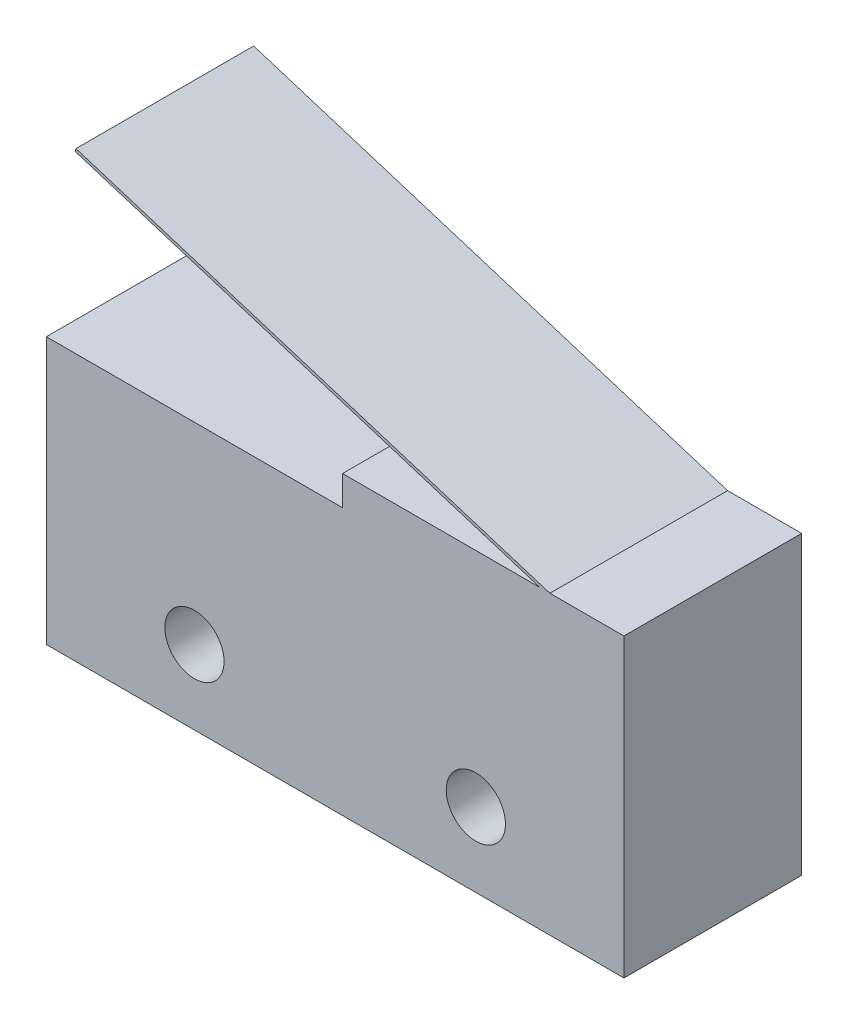
ISO-10303-21;
HEADER;
FILE_DESCRIPTION(('STEP AP214'),'2;1');
FILE_NAME('part.step','',(''),(''),'','','');
FILE_SCHEMA(('AUTOMOTIVE_DESIGN { 1 0 10303 214 1 1 1 1 }'));
ENDSEC;
DATA;
#1=APPLICATION_CONTEXT('core data for automotive mechanical design processes');
#2=APPLICATION_PROTOCOL_DEFINITION('international standard','automotive_design',2000,#1);
#3=PRODUCT_CONTEXT('',#1,'mechanical');
#4=PRODUCT('Part','Part','',(#3));
#5=PRODUCT_RELATED_PRODUCT_CATEGORY('part','',(#4));
#6=PRODUCT_DEFINITION_FORMATION('','',#4);
#7=PRODUCT_DEFINITION_CONTEXT('part definition',#1,'design');
#8=PRODUCT_DEFINITION('design','',#6,#7);
#9=PRODUCT_DEFINITION_SHAPE('','',#8);
#10=(LENGTH_UNIT() NAMED_UNIT(*) SI_UNIT(.MILLI.,.METRE.));
#11=(NAMED_UNIT(*) PLANE_ANGLE_UNIT() SI_UNIT($,.RADIAN.));
#12=(NAMED_UNIT(*) SI_UNIT($,.STERADIAN.) SOLID_ANGLE_UNIT());
#13=UNCERTAINTY_MEASURE_WITH_UNIT(LENGTH_MEASURE(1.E-05),#10,'distance_accuracy_value','');
#14=(GEOMETRIC_REPRESENTATION_CONTEXT(3) GLOBAL_UNCERTAINTY_ASSIGNED_CONTEXT((#13)) GLOBAL_UNIT_ASSIGNED_CONTEXT((#10,
#11,#12)) REPRESENTATION_CONTEXT('',''));
#15=CARTESIAN_POINT('',(0.,0.,0.));
#16=DIRECTION('',(0.,0.,1.));
#17=DIRECTION('',(1.,0.,0.));
#18=AXIS2_PLACEMENT_3D('',#15,#16,#17);
#19=CARTESIAN_POINT('',(0.25,5.,6.));
#20=DIRECTION('',(0.,-1.,0.));
#21=DIRECTION('',(0.,0.,-1.));
#22=AXIS2_PLACEMENT_3D('',#19,#20,#21);
#23=PLANE('',#22);
#24=DIRECTION('',(0.,0.,-1.));
#25=VECTOR('',#24,1.);
#26=CARTESIAN_POINT('',(7.25,5.,6.));
#27=LINE('',#26,#25);
#28=CARTESIAN_POINT('',(7.25,5.,6.));
#29=VERTEX_POINT('',#28);
#30=CARTESIAN_POINT('',(7.25,5.,0.));
#31=VERTEX_POINT('',#30);
#32=EDGE_CURVE('E194',#29,#31,#27,.T.);
#33=ORIENTED_EDGE('',*,*,#32,.F.);
#34=DIRECTION('',(-1.,0.,0.));
#35=VECTOR('',#34,1.);
#36=CARTESIAN_POINT('',(0.25,5.,6.));
#37=LINE('',#36,#35);
#38=CARTESIAN_POINT('',(9.75,5.,6.));
#39=VERTEX_POINT('',#38);
#40=EDGE_CURVE('E92',#39,#29,#37,.T.);
#41=ORIENTED_EDGE('',*,*,#40,.F.);
#42=DIRECTION('',(0.,0.,-1.));
#43=VECTOR('',#42,1.);
#44=CARTESIAN_POINT('',(9.75,5.,6.));
#45=LINE('',#44,#43);
#46=CARTESIAN_POINT('',(9.75,5.,0.));
#47=VERTEX_POINT('',#46);
#48=EDGE_CURVE('E11',#39,#47,#45,.T.);
#49=ORIENTED_EDGE('',*,*,#48,.T.);
#50=DIRECTION('',(-1.,0.,0.));
#51=VECTOR('',#50,1.);
#52=CARTESIAN_POINT('',(0.25,5.,0.));
#53=LINE('',#52,#51);
#54=EDGE_CURVE('E137',#47,#31,#53,.T.);
#55=ORIENTED_EDGE('',*,*,#54,.T.);
#56=EDGE_LOOP('',(#33,#41,#49,#55));
#57=FACE_BOUND('',#56,.T.);
#58=ADVANCED_FACE('F33',(#57),#23,.F.);
#59=CARTESIAN_POINT('',(0.,0.,6.));
#60=DIRECTION('',(0.,0.,-1.));
#61=DIRECTION('',(-1.,0.,0.));
#62=AXIS2_PLACEMENT_3D('',#59,#60,#61);
#63=PLANE('',#62);
#64=DIRECTION('',(0.,1.,0.));
#65=VECTOR('',#64,1.);
#66=CARTESIAN_POINT('',(9.75,-5.,6.));
#67=LINE('',#66,#65);
#68=CARTESIAN_POINT('',(9.75,-5.,6.));
#69=VERTEX_POINT('',#68);
#70=EDGE_CURVE('E146',#69,#39,#67,.T.);
#71=ORIENTED_EDGE('',*,*,#70,.T.);
#72=ORIENTED_EDGE('',*,*,#40,.T.);
#73=DIRECTION('',(0.95447997803503,-0.298274993135947,0.));
#74=VECTOR('',#73,1.);
#75=CARTESIAN_POINT('',(7.25,5.,6.));
#76=LINE('',#75,#74);
#77=CARTESIAN_POINT('',(-8.75,10.,6.));
#78=VERTEX_POINT('',#77);
#79=EDGE_CURVE('E175',#78,#29,#76,.T.);
#80=ORIENTED_EDGE('',*,*,#79,.F.);
#81=DIRECTION('',(0.298274993135952,0.954479978035028,0.));
#82=VECTOR('',#81,1.);
#83=CARTESIAN_POINT('',(-8.75,10.,6.));
#84=LINE('',#83,#82);
#85=CARTESIAN_POINT('',(-8.7798274993136,9.9045520021965,6.));
#86=VERTEX_POINT('',#85);
#87=EDGE_CURVE('E203',#86,#78,#84,.T.);
#88=ORIENTED_EDGE('',*,*,#87,.F.);
#89=DIRECTION('',(-0.95447997803503,0.298274993135947,0.));
#90=VECTOR('',#89,1.);
#91=CARTESIAN_POINT('',(-8.7798274993136,9.9045520021965,6.));
#92=LINE('',#91,#90);
#93=CARTESIAN_POINT('',(6.91473890771519,5.,6.));
#94=VERTEX_POINT('',#93);
#95=EDGE_CURVE('E206',#94,#86,#92,.T.);
#96=ORIENTED_EDGE('',*,*,#95,.F.);
#97=CARTESIAN_POINT('',(0.25,5.,6.));
#98=VERTEX_POINT('',#97);
#99=EDGE_CURVE('E165',#94,#98,#37,.T.);
#100=ORIENTED_EDGE('',*,*,#99,.T.);
#101=DIRECTION('',(0.,-1.,0.));
#102=VECTOR('',#101,1.);
#103=CARTESIAN_POINT('',(0.25,4.,6.));
#104=LINE('',#103,#102);
#105=CARTESIAN_POINT('',(0.25,4.,6.));
#106=VERTEX_POINT('',#105);
#107=EDGE_CURVE('E111',#98,#106,#104,.T.);
#108=ORIENTED_EDGE('',*,*,#107,.T.);
#109=DIRECTION('',(-1.,0.,0.));
#110=VECTOR('',#109,1.);
#111=CARTESIAN_POINT('',(-9.75,4.,6.));
#112=LINE('',#111,#110);
#113=CARTESIAN_POINT('',(-9.75,4.,6.));
#114=VERTEX_POINT('',#113);
#115=EDGE_CURVE('E103',#106,#114,#112,.T.);
#116=ORIENTED_EDGE('',*,*,#115,.T.);
#117=DIRECTION('',(0.,-1.,0.));
#118=VECTOR('',#117,1.);
#119=CARTESIAN_POINT('',(-9.75,-5.,6.));
#120=LINE('',#119,#118);
#121=CARTESIAN_POINT('',(-9.75,-5.,6.));
#122=VERTEX_POINT('',#121);
#123=EDGE_CURVE('E108',#114,#122,#120,.T.);
#124=ORIENTED_EDGE('',*,*,#123,.T.);
#125=DIRECTION('',(1.,0.,0.));
#126=VECTOR('',#125,1.);
#127=CARTESIAN_POINT('',(-9.75,-5.,6.));
#128=LINE('',#127,#126);
#129=EDGE_CURVE('E57',#122,#69,#128,.T.);
#130=ORIENTED_EDGE('',*,*,#129,.T.);
#131=EDGE_LOOP('',(#71,#72,#80,#88,#96,#100,#108,#116,#124,#130));
#132=FACE_BOUND('',#131,.T.);
#133=CARTESIAN_POINT('',(-4.75,-2.5,6.));
#134=DIRECTION('',(0.,0.,1.));
#135=DIRECTION('',(1.,0.,0.));
#136=AXIS2_PLACEMENT_3D('',#133,#134,#135);
#137=CIRCLE('',#136,1.);
#138=CARTESIAN_POINT('',(-3.75,-2.5,6.));
#139=VERTEX_POINT('',#138);
#140=EDGE_CURVE('E136',#139,#139,#137,.T.);
#141=ORIENTED_EDGE('',*,*,#140,.F.);
#142=EDGE_LOOP('',(#141));
#143=FACE_BOUND('',#142,.T.);
#144=CARTESIAN_POINT('',(4.75,-2.5,6.));
#145=DIRECTION('',(0.,0.,1.));
#146=DIRECTION('',(-1.,0.,0.));
#147=AXIS2_PLACEMENT_3D('',#144,#145,#146);
#148=CIRCLE('',#147,1.);
#149=CARTESIAN_POINT('',(3.75,-2.5,6.));
#150=VERTEX_POINT('',#149);
#151=EDGE_CURVE('E220',#150,#150,#148,.T.);
#152=ORIENTED_EDGE('',*,*,#151,.F.);
#153=EDGE_LOOP('',(#152));
#154=FACE_BOUND('',#153,.T.);
#155=ADVANCED_FACE('F105',(#132,#143,#154),#63,.F.);
#156=CARTESIAN_POINT('',(0.,0.,0.));
#157=DIRECTION('',(0.,0.,-1.));
#158=DIRECTION('',(-1.,0.,0.));
#159=AXIS2_PLACEMENT_3D('',#156,#157,#158);
#160=PLANE('',#159);
#161=CARTESIAN_POINT('',(-4.75,-2.5,0.));
#162=DIRECTION('',(0.,0.,1.));
#163=DIRECTION('',(1.,0.,0.));
#164=AXIS2_PLACEMENT_3D('',#161,#162,#163);
#165=CIRCLE('',#164,1.);
#166=CARTESIAN_POINT('',(-3.75,-2.5,0.));
#167=VERTEX_POINT('',#166);
#168=EDGE_CURVE('E169',#167,#167,#165,.T.);
#169=ORIENTED_EDGE('',*,*,#168,.T.);
#170=EDGE_LOOP('',(#169));
#171=FACE_BOUND('',#170,.T.);
#172=DIRECTION('',(0.,1.,0.));
#173=VECTOR('',#172,1.);
#174=CARTESIAN_POINT('',(9.75,-5.,0.));
#175=LINE('',#174,#173);
#176=CARTESIAN_POINT('',(9.75,-5.,0.));
#177=VERTEX_POINT('',#176);
#178=EDGE_CURVE('E132',#177,#47,#175,.T.);
#179=ORIENTED_EDGE('',*,*,#178,.F.);
#180=DIRECTION('',(1.,0.,0.));
#181=VECTOR('',#180,1.);
#182=CARTESIAN_POINT('',(-9.75,-5.,0.));
#183=LINE('',#182,#181);
#184=CARTESIAN_POINT('',(-9.75,-5.,0.));
#185=VERTEX_POINT('',#184);
#186=EDGE_CURVE('E84',#185,#177,#183,.T.);
#187=ORIENTED_EDGE('',*,*,#186,.F.);
#188=DIRECTION('',(0.,-1.,0.));
#189=VECTOR('',#188,1.);
#190=CARTESIAN_POINT('',(-9.75,-5.,0.));
#191=LINE('',#190,#189);
#192=CARTESIAN_POINT('',(-9.75,4.,0.));
#193=VERTEX_POINT('',#192);
#194=EDGE_CURVE('E143',#193,#185,#191,.T.);
#195=ORIENTED_EDGE('',*,*,#194,.F.);
#196=DIRECTION('',(-1.,0.,0.));
#197=VECTOR('',#196,1.);
#198=CARTESIAN_POINT('',(-9.75,4.,0.));
#199=LINE('',#198,#197);
#200=CARTESIAN_POINT('',(0.25,4.,0.));
#201=VERTEX_POINT('',#200);
#202=EDGE_CURVE('E120',#201,#193,#199,.T.);
#203=ORIENTED_EDGE('',*,*,#202,.F.);
#204=DIRECTION('',(0.,-1.,0.));
#205=VECTOR('',#204,1.);
#206=CARTESIAN_POINT('',(0.25,4.,0.));
#207=LINE('',#206,#205);
#208=CARTESIAN_POINT('',(0.25,5.,0.));
#209=VERTEX_POINT('',#208);
#210=EDGE_CURVE('E140',#209,#201,#207,.T.);
#211=ORIENTED_EDGE('',*,*,#210,.F.);
#212=CARTESIAN_POINT('',(6.91473890771519,5.,0.));
#213=VERTEX_POINT('',#212);
#214=EDGE_CURVE('E135',#213,#209,#53,.T.);
#215=ORIENTED_EDGE('',*,*,#214,.F.);
#216=DIRECTION('',(-0.95447997803503,0.298274993135947,0.));
#217=VECTOR('',#216,1.);
#218=CARTESIAN_POINT('',(-8.7798274993136,9.9045520021965,0.));
#219=LINE('',#218,#217);
#220=CARTESIAN_POINT('',(-8.7798274993136,9.9045520021965,0.));
#221=VERTEX_POINT('',#220);
#222=EDGE_CURVE('E48',#213,#221,#219,.T.);
#223=ORIENTED_EDGE('',*,*,#222,.T.);
#224=DIRECTION('',(0.298274993135952,0.954479978035028,0.));
#225=VECTOR('',#224,1.);
#226=CARTESIAN_POINT('',(-8.75,10.,0.));
#227=LINE('',#226,#225);
#228=CARTESIAN_POINT('',(-8.75,10.,0.));
#229=VERTEX_POINT('',#228);
#230=EDGE_CURVE('E204',#221,#229,#227,.T.);
#231=ORIENTED_EDGE('',*,*,#230,.T.);
#232=DIRECTION('',(0.95447997803503,-0.298274993135947,0.));
#233=VECTOR('',#232,1.);
#234=CARTESIAN_POINT('',(7.25,5.,0.));
#235=LINE('',#234,#233);
#236=EDGE_CURVE('E209',#229,#31,#235,.T.);
#237=ORIENTED_EDGE('',*,*,#236,.T.);
#238=ORIENTED_EDGE('',*,*,#54,.F.);
#239=EDGE_LOOP('',(#179,#187,#195,#203,#211,#215,#223,#231,#237,#238));
#240=FACE_BOUND('',#239,.T.);
#241=CARTESIAN_POINT('',(4.75,-2.5,0.));
#242=DIRECTION('',(0.,0.,1.));
#243=DIRECTION('',(-1.,0.,0.));
#244=AXIS2_PLACEMENT_3D('',#241,#242,#243);
#245=CIRCLE('',#244,1.);
#246=CARTESIAN_POINT('',(3.75,-2.5,0.));
#247=VERTEX_POINT('',#246);
#248=EDGE_CURVE('E217',#247,#247,#245,.T.);
#249=ORIENTED_EDGE('',*,*,#248,.T.);
#250=EDGE_LOOP('',(#249));
#251=FACE_BOUND('',#250,.T.);
#252=ADVANCED_FACE('F159',(#171,#240,#251),#160,.T.);
#253=CARTESIAN_POINT('',(9.75,-5.,6.));
#254=DIRECTION('',(-1.,0.,0.));
#255=DIRECTION('',(0.,0.,1.));
#256=AXIS2_PLACEMENT_3D('',#253,#254,#255);
#257=PLANE('',#256);
#258=ORIENTED_EDGE('',*,*,#178,.T.);
#259=ORIENTED_EDGE('',*,*,#48,.F.);
#260=ORIENTED_EDGE('',*,*,#70,.F.);
#261=DIRECTION('',(0.,0.,-1.));
#262=VECTOR('',#261,1.);
#263=CARTESIAN_POINT('',(9.75,-5.,6.));
#264=LINE('',#263,#262);
#265=EDGE_CURVE('E128',#69,#177,#264,.T.);
#266=ORIENTED_EDGE('',*,*,#265,.T.);
#267=EDGE_LOOP('',(#258,#259,#260,#266));
#268=FACE_BOUND('',#267,.T.);
#269=ADVANCED_FACE('F35',(#268),#257,.F.);
#270=ORIENTED_EDGE('',*,*,#99,.F.);
#271=DIRECTION('',(0.,0.,-1.));
#272=VECTOR('',#271,1.);
#273=CARTESIAN_POINT('',(6.91473890771519,5.,6.));
#274=LINE('',#273,#272);
#275=EDGE_CURVE('E198',#94,#213,#274,.T.);
#276=ORIENTED_EDGE('',*,*,#275,.T.);
#277=ORIENTED_EDGE('',*,*,#214,.T.);
#278=DIRECTION('',(0.,0.,-1.));
#279=VECTOR('',#278,1.);
#280=CARTESIAN_POINT('',(0.25,5.,6.));
#281=LINE('',#280,#279);
#282=EDGE_CURVE('E41',#98,#209,#281,.T.);
#283=ORIENTED_EDGE('',*,*,#282,.F.);
#284=EDGE_LOOP('',(#270,#276,#277,#283));
#285=FACE_BOUND('',#284,.T.);
#286=ADVANCED_FACE('F245',(#285),#23,.F.);
#287=CARTESIAN_POINT('',(0.25,4.,6.));
#288=DIRECTION('',(1.,0.,0.));
#289=DIRECTION('',(0.,0.,-1.));
#290=AXIS2_PLACEMENT_3D('',#287,#288,#289);
#291=PLANE('',#290);
#292=ORIENTED_EDGE('',*,*,#210,.T.);
#293=DIRECTION('',(0.,0.,-1.));
#294=VECTOR('',#293,1.);
#295=CARTESIAN_POINT('',(0.25,4.,6.));
#296=LINE('',#295,#294);
#297=EDGE_CURVE('E123',#106,#201,#296,.T.);
#298=ORIENTED_EDGE('',*,*,#297,.F.);
#299=ORIENTED_EDGE('',*,*,#107,.F.);
#300=ORIENTED_EDGE('',*,*,#282,.T.);
#301=EDGE_LOOP('',(#292,#298,#299,#300));
#302=FACE_BOUND('',#301,.T.);
#303=ADVANCED_FACE('F153',(#302),#291,.F.);
#304=CARTESIAN_POINT('',(-9.75,4.,6.));
#305=DIRECTION('',(0.,-1.,0.));
#306=DIRECTION('',(0.,0.,-1.));
#307=AXIS2_PLACEMENT_3D('',#304,#305,#306);
#308=PLANE('',#307);
#309=ORIENTED_EDGE('',*,*,#202,.T.);
#310=DIRECTION('',(0.,0.,-1.));
#311=VECTOR('',#310,1.);
#312=CARTESIAN_POINT('',(-9.75,4.,6.));
#313=LINE('',#312,#311);
#314=EDGE_CURVE('E117',#114,#193,#313,.T.);
#315=ORIENTED_EDGE('',*,*,#314,.F.);
#316=ORIENTED_EDGE('',*,*,#115,.F.);
#317=ORIENTED_EDGE('',*,*,#297,.T.);
#318=EDGE_LOOP('',(#309,#315,#316,#317));
#319=FACE_BOUND('',#318,.T.);
#320=ADVANCED_FACE('F118',(#319),#308,.F.);
#321=CARTESIAN_POINT('',(-9.75,-5.,6.));
#322=DIRECTION('',(1.,0.,0.));
#323=DIRECTION('',(0.,0.,-1.));
#324=AXIS2_PLACEMENT_3D('',#321,#322,#323);
#325=PLANE('',#324);
#326=ORIENTED_EDGE('',*,*,#194,.T.);
#327=DIRECTION('',(0.,0.,-1.));
#328=VECTOR('',#327,1.);
#329=CARTESIAN_POINT('',(-9.75,-5.,6.));
#330=LINE('',#329,#328);
#331=EDGE_CURVE('E124',#122,#185,#330,.T.);
#332=ORIENTED_EDGE('',*,*,#331,.F.);
#333=ORIENTED_EDGE('',*,*,#123,.F.);
#334=ORIENTED_EDGE('',*,*,#314,.T.);
#335=EDGE_LOOP('',(#326,#332,#333,#334));
#336=FACE_BOUND('',#335,.T.);
#337=ADVANCED_FACE('F126',(#336),#325,.F.);
#338=CARTESIAN_POINT('',(-9.75,-5.,6.));
#339=DIRECTION('',(0.,1.,0.));
#340=DIRECTION('',(0.,0.,1.));
#341=AXIS2_PLACEMENT_3D('',#338,#339,#340);
#342=PLANE('',#341);
#343=ORIENTED_EDGE('',*,*,#186,.T.);
#344=ORIENTED_EDGE('',*,*,#265,.F.);
#345=ORIENTED_EDGE('',*,*,#129,.F.);
#346=ORIENTED_EDGE('',*,*,#331,.T.);
#347=EDGE_LOOP('',(#343,#344,#345,#346));
#348=FACE_BOUND('',#347,.T.);
#349=ADVANCED_FACE('F161',(#348),#342,.F.);
#350=CARTESIAN_POINT('',(-4.75,-2.5,6.));
#351=DIRECTION('',(0.,0.,-1.));
#352=DIRECTION('',(-1.,0.,0.));
#353=AXIS2_PLACEMENT_3D('',#350,#351,#352);
#354=CYLINDRICAL_SURFACE('',#353,1.);
#355=ORIENTED_EDGE('',*,*,#140,.T.);
#356=EDGE_LOOP('',(#355));
#357=FACE_BOUND('',#356,.T.);
#358=ORIENTED_EDGE('',*,*,#168,.F.);
#359=EDGE_LOOP('',(#358));
#360=FACE_BOUND('',#359,.T.);
#361=ADVANCED_FACE('F231',(#357,#360),#354,.F.);
#362=CARTESIAN_POINT('',(4.75,-2.5,6.));
#363=DIRECTION('',(0.,0.,-1.));
#364=DIRECTION('',(-1.,0.,0.));
#365=AXIS2_PLACEMENT_3D('',#362,#363,#364);
#366=CYLINDRICAL_SURFACE('',#365,1.);
#367=ORIENTED_EDGE('',*,*,#151,.T.);
#368=EDGE_LOOP('',(#367));
#369=FACE_BOUND('',#368,.T.);
#370=ORIENTED_EDGE('',*,*,#248,.F.);
#371=EDGE_LOOP('',(#370));
#372=FACE_BOUND('',#371,.T.);
#373=ADVANCED_FACE('F233',(#369,#372),#366,.F.);
#374=CARTESIAN_POINT('',(7.25,5.,6.));
#375=DIRECTION('',(0.298274993135947,0.95447997803503,0.));
#376=DIRECTION('',(-0.95447997803503,0.298274993135947,0.));
#377=AXIS2_PLACEMENT_3D('',#374,#375,#376);
#378=PLANE('',#377);
#379=ORIENTED_EDGE('',*,*,#236,.F.);
#380=DIRECTION('',(0.,0.,-1.));
#381=VECTOR('',#380,1.);
#382=CARTESIAN_POINT('',(-8.75,10.,6.));
#383=LINE('',#382,#381);
#384=EDGE_CURVE('E190',#78,#229,#383,.T.);
#385=ORIENTED_EDGE('',*,*,#384,.F.);
#386=ORIENTED_EDGE('',*,*,#79,.T.);
#387=ORIENTED_EDGE('',*,*,#32,.T.);
#388=EDGE_LOOP('',(#379,#385,#386,#387));
#389=FACE_BOUND('',#388,.T.);
#390=ADVANCED_FACE('F239',(#389),#378,.T.);
#391=CARTESIAN_POINT('',(-8.75,10.,6.));
#392=DIRECTION('',(-0.954479978035028,0.298274993135952,0.));
#393=DIRECTION('',(-0.298274993135952,-0.954479978035028,0.));
#394=AXIS2_PLACEMENT_3D('',#391,#392,#393);
#395=PLANE('',#394);
#396=ORIENTED_EDGE('',*,*,#230,.F.);
#397=DIRECTION('',(0.,0.,-1.));
#398=VECTOR('',#397,1.);
#399=CARTESIAN_POINT('',(-8.7798274993136,9.9045520021965,6.));
#400=LINE('',#399,#398);
#401=EDGE_CURVE('E201',#86,#221,#400,.T.);
#402=ORIENTED_EDGE('',*,*,#401,.F.);
#403=ORIENTED_EDGE('',*,*,#87,.T.);
#404=ORIENTED_EDGE('',*,*,#384,.T.);
#405=EDGE_LOOP('',(#396,#402,#403,#404));
#406=FACE_BOUND('',#405,.T.);
#407=ADVANCED_FACE('F202',(#406),#395,.T.);
#408=CARTESIAN_POINT('',(-8.7798274993136,9.9045520021965,6.));
#409=DIRECTION('',(-0.298274993135947,-0.95447997803503,0.));
#410=DIRECTION('',(0.95447997803503,-0.298274993135947,0.));
#411=AXIS2_PLACEMENT_3D('',#408,#409,#410);
#412=PLANE('',#411);
#413=ORIENTED_EDGE('',*,*,#222,.F.);
#414=ORIENTED_EDGE('',*,*,#275,.F.);
#415=ORIENTED_EDGE('',*,*,#95,.T.);
#416=ORIENTED_EDGE('',*,*,#401,.T.);
#417=EDGE_LOOP('',(#413,#414,#415,#416));
#418=FACE_BOUND('',#417,.T.);
#419=ADVANCED_FACE('F208',(#418),#412,.T.);
#420=CLOSED_SHELL('',(#58,#155,#252,#269,#286,#303,#320,#337,#349,#361,#373,#390,#407,#419));
#421=MANIFOLD_SOLID_BREP('B2',#420);
#422=ADVANCED_BREP_SHAPE_REPRESENTATION('',(#18,#421),#14);
#423=SHAPE_DEFINITION_REPRESENTATION(#9,#422);
ENDSEC;
END-ISO-10303-21;
